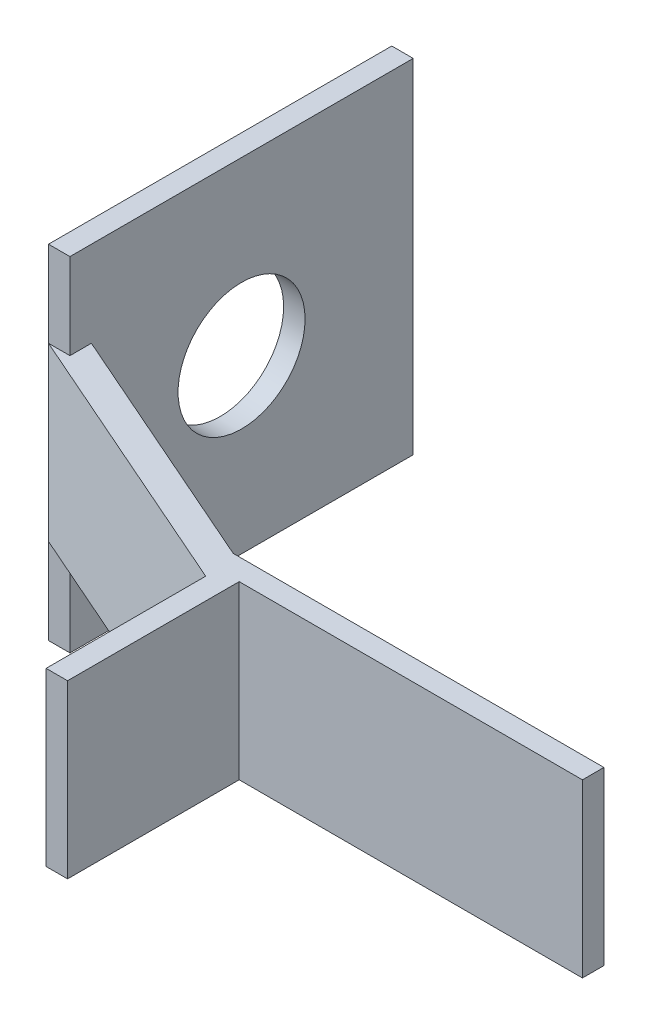
ISO-10303-21;
HEADER;
FILE_DESCRIPTION(('STEP AP214'),'2;1');
FILE_NAME('part.step','',(''),(''),'','','');
FILE_SCHEMA(('AUTOMOTIVE_DESIGN { 1 0 10303 214 1 1 1 1 }'));
ENDSEC;
DATA;
#1=APPLICATION_CONTEXT('core data for automotive mechanical design processes');
#2=APPLICATION_PROTOCOL_DEFINITION('international standard','automotive_design',2000,#1);
#3=PRODUCT_CONTEXT('',#1,'mechanical');
#4=PRODUCT('Part','Part','',(#3));
#5=PRODUCT_RELATED_PRODUCT_CATEGORY('part','',(#4));
#6=PRODUCT_DEFINITION_FORMATION('','',#4);
#7=PRODUCT_DEFINITION_CONTEXT('part definition',#1,'design');
#8=PRODUCT_DEFINITION('design','',#6,#7);
#9=PRODUCT_DEFINITION_SHAPE('','',#8);
#10=(LENGTH_UNIT() NAMED_UNIT(*) SI_UNIT(.MILLI.,.METRE.));
#11=(NAMED_UNIT(*) PLANE_ANGLE_UNIT() SI_UNIT($,.RADIAN.));
#12=(NAMED_UNIT(*) SI_UNIT($,.STERADIAN.) SOLID_ANGLE_UNIT());
#13=UNCERTAINTY_MEASURE_WITH_UNIT(LENGTH_MEASURE(1.E-05),#10,'distance_accuracy_value','');
#14=(GEOMETRIC_REPRESENTATION_CONTEXT(3) GLOBAL_UNCERTAINTY_ASSIGNED_CONTEXT((#13)) GLOBAL_UNIT_ASSIGNED_CONTEXT((#10,
#11,#12)) REPRESENTATION_CONTEXT('',''));
#15=CARTESIAN_POINT('',(0.,0.,0.));
#16=DIRECTION('',(0.,0.,1.));
#17=DIRECTION('',(1.,0.,0.));
#18=AXIS2_PLACEMENT_3D('',#15,#16,#17);
#19=CARTESIAN_POINT('',(44.6594687239784,25.4,45.013650572561));
#20=DIRECTION('',(1.,0.,0.));
#21=DIRECTION('',(0.,0.,-1.));
#22=AXIS2_PLACEMENT_3D('',#19,#20,#21);
#23=PLANE('',#22);
#24=DIRECTION('',(0.,0.,-1.));
#25=VECTOR('',#24,1.);
#26=CARTESIAN_POINT('',(44.6594687239784,-12.7,55.7043729882578));
#27=LINE('',#26,#25);
#28=CARTESIAN_POINT('',(44.6594687239784,-12.7,41.838650572561));
#29=VERTEX_POINT('',#28);
#30=CARTESIAN_POINT('',(44.6594687239784,-12.7,67.2386505725609));
#31=VERTEX_POINT('',#30);
#32=EDGE_CURVE('E194',#29,#31,#27,.F.);
#33=ORIENTED_EDGE('',*,*,#32,.F.);
#34=DIRECTION('',(0.,-1.,0.));
#35=VECTOR('',#34,1.);
#36=CARTESIAN_POINT('',(44.6594687239784,25.4,41.838650572561));
#37=LINE('',#36,#35);
#38=CARTESIAN_POINT('',(44.6594687239784,12.7,41.838650572561));
#39=VERTEX_POINT('',#38);
#40=EDGE_CURVE('E147',#39,#29,#37,.T.);
#41=ORIENTED_EDGE('',*,*,#40,.F.);
#42=DIRECTION('',(0.,0.,-1.));
#43=VECTOR('',#42,1.);
#44=CARTESIAN_POINT('',(44.6594687239784,12.7,40.4098603424682));
#45=LINE('',#44,#43);
#46=CARTESIAN_POINT('',(44.6594687239784,12.7,67.238650572561));
#47=VERTEX_POINT('',#46);
#48=EDGE_CURVE('E164',#39,#47,#45,.F.);
#49=ORIENTED_EDGE('',*,*,#48,.T.);
#50=DIRECTION('',(0.,-1.,0.));
#51=VECTOR('',#50,1.);
#52=CARTESIAN_POINT('',(44.6594687239784,25.4,67.238650572561));
#53=LINE('',#52,#51);
#54=EDGE_CURVE('E150',#31,#47,#53,.F.);
#55=ORIENTED_EDGE('',*,*,#54,.F.);
#56=EDGE_LOOP('',(#33,#41,#49,#55));
#57=FACE_BOUND('',#56,.T.);
#58=ADVANCED_FACE('F17',(#57),#23,.T.);
#59=CARTESIAN_POINT('',(44.6594687239784,25.4,67.238650572561));
#60=DIRECTION('',(0.,0.,1.));
#61=DIRECTION('',(0.,-1.,0.));
#62=AXIS2_PLACEMENT_3D('',#59,#60,#61);
#63=PLANE('',#62);
#64=DIRECTION('',(1.,0.,0.));
#65=VECTOR('',#64,1.);
#66=CARTESIAN_POINT('',(43.0297942493115,-12.7,67.2386505725607));
#67=LINE('',#66,#65);
#68=CARTESIAN_POINT('',(41.4844687239784,-12.7,67.2386505725608));
#69=VERTEX_POINT('',#68);
#70=EDGE_CURVE('E159',#31,#69,#67,.F.);
#71=ORIENTED_EDGE('',*,*,#70,.F.);
#72=ORIENTED_EDGE('',*,*,#54,.T.);
#73=DIRECTION('',(1.,0.,0.));
#74=VECTOR('',#73,1.);
#75=CARTESIAN_POINT('',(46.1214883591934,12.7,67.238650572561));
#76=LINE('',#75,#74);
#77=CARTESIAN_POINT('',(41.4844687239784,12.7,67.2386505725609));
#78=VERTEX_POINT('',#77);
#79=EDGE_CURVE('E157',#47,#78,#76,.F.);
#80=ORIENTED_EDGE('',*,*,#79,.T.);
#81=DIRECTION('',(0.,1.,0.));
#82=VECTOR('',#81,1.);
#83=CARTESIAN_POINT('',(41.4844687239784,25.4,67.2386505725607));
#84=LINE('',#83,#82);
#85=EDGE_CURVE('E196',#69,#78,#84,.T.);
#86=ORIENTED_EDGE('',*,*,#85,.F.);
#87=EDGE_LOOP('',(#71,#72,#80,#86));
#88=FACE_BOUND('',#87,.T.);
#89=ADVANCED_FACE('F155',(#88),#63,.T.);
#90=CARTESIAN_POINT('',(40.6051254319654,25.4,38.663650572561));
#91=DIRECTION('',(0.,0.,-1.));
#92=DIRECTION('',(0.,1.,0.));
#93=AXIS2_PLACEMENT_3D('',#90,#91,#92);
#94=PLANE('',#93);
#95=DIRECTION('',(1.,0.,0.));
#96=VECTOR('',#95,1.);
#97=CARTESIAN_POINT('',(43.0297942493115,-12.7,38.663650572561));
#98=LINE('',#97,#96);
#99=CARTESIAN_POINT('',(40.6051254319654,-12.7,38.6636505725609));
#100=VERTEX_POINT('',#99);
#101=CARTESIAN_POINT('',(95.4594687239786,-12.7,38.663650572561));
#102=VERTEX_POINT('',#101);
#103=EDGE_CURVE('E125',#100,#102,#98,.T.);
#104=ORIENTED_EDGE('',*,*,#103,.F.);
#105=DIRECTION('',(0.,1.,0.));
#106=VECTOR('',#105,1.);
#107=CARTESIAN_POINT('',(40.6051254319654,25.4,38.6636505725609));
#108=LINE('',#107,#106);
#109=CARTESIAN_POINT('',(40.6051254319654,12.7,38.6636505725609));
#110=VERTEX_POINT('',#109);
#111=EDGE_CURVE('E121',#110,#100,#108,.F.);
#112=ORIENTED_EDGE('',*,*,#111,.F.);
#113=DIRECTION('',(1.,0.,0.));
#114=VECTOR('',#113,1.);
#115=CARTESIAN_POINT('',(46.1214883591934,12.7,38.663650572561));
#116=LINE('',#115,#114);
#117=CARTESIAN_POINT('',(95.4594687239786,12.7,38.663650572561));
#118=VERTEX_POINT('',#117);
#119=EDGE_CURVE('E124',#110,#118,#116,.T.);
#120=ORIENTED_EDGE('',*,*,#119,.T.);
#121=DIRECTION('',(0.,1.,0.));
#122=VECTOR('',#121,1.);
#123=CARTESIAN_POINT('',(95.4594687239786,25.4,38.663650572561));
#124=LINE('',#123,#122);
#125=EDGE_CURVE('E115',#102,#118,#124,.T.);
#126=ORIENTED_EDGE('',*,*,#125,.F.);
#127=EDGE_LOOP('',(#104,#112,#120,#126));
#128=FACE_BOUND('',#127,.T.);
#129=ADVANCED_FACE('F123',(#128),#94,.T.);
#130=CARTESIAN_POINT('',(95.4594687239786,25.4,38.663650572561));
#131=DIRECTION('',(1.,0.,0.));
#132=DIRECTION('',(0.,0.,-1.));
#133=AXIS2_PLACEMENT_3D('',#130,#131,#132);
#134=PLANE('',#133);
#135=DIRECTION('',(0.,0.,-1.));
#136=VECTOR('',#135,1.);
#137=CARTESIAN_POINT('',(95.4594687239786,-12.7,55.7043729882578));
#138=LINE('',#137,#136);
#139=CARTESIAN_POINT('',(95.4594687239786,-12.7,41.838650572561));
#140=VERTEX_POINT('',#139);
#141=EDGE_CURVE('E176',#102,#140,#138,.F.);
#142=ORIENTED_EDGE('',*,*,#141,.F.);
#143=ORIENTED_EDGE('',*,*,#125,.T.);
#144=DIRECTION('',(0.,0.,-1.));
#145=VECTOR('',#144,1.);
#146=CARTESIAN_POINT('',(95.4594687239786,12.7,40.4098603424682));
#147=LINE('',#146,#145);
#148=CARTESIAN_POINT('',(95.4594687239786,12.7,41.838650572561));
#149=VERTEX_POINT('',#148);
#150=EDGE_CURVE('E138',#118,#149,#147,.F.);
#151=ORIENTED_EDGE('',*,*,#150,.T.);
#152=DIRECTION('',(0.,-1.,0.));
#153=VECTOR('',#152,1.);
#154=CARTESIAN_POINT('',(95.4594687239786,25.4,41.838650572561));
#155=LINE('',#154,#153);
#156=EDGE_CURVE('E131',#140,#149,#155,.F.);
#157=ORIENTED_EDGE('',*,*,#156,.F.);
#158=EDGE_LOOP('',(#142,#143,#151,#157));
#159=FACE_BOUND('',#158,.T.);
#160=ADVANCED_FACE('F174',(#159),#134,.T.);
#161=CARTESIAN_POINT('',(95.4594687239786,25.4,41.838650572561));
#162=DIRECTION('',(0.,0.,1.));
#163=DIRECTION('',(0.,-1.,0.));
#164=AXIS2_PLACEMENT_3D('',#161,#162,#163);
#165=PLANE('',#164);
#166=DIRECTION('',(1.,0.,0.));
#167=VECTOR('',#166,1.);
#168=CARTESIAN_POINT('',(43.0297942493115,-12.7,41.838650572561));
#169=LINE('',#168,#167);
#170=EDGE_CURVE('E179',#140,#29,#169,.F.);
#171=ORIENTED_EDGE('',*,*,#170,.F.);
#172=ORIENTED_EDGE('',*,*,#156,.T.);
#173=DIRECTION('',(1.,0.,0.));
#174=VECTOR('',#173,1.);
#175=CARTESIAN_POINT('',(46.1214883591934,12.7,41.838650572561));
#176=LINE('',#175,#174);
#177=EDGE_CURVE('E169',#149,#39,#176,.F.);
#178=ORIENTED_EDGE('',*,*,#177,.T.);
#179=ORIENTED_EDGE('',*,*,#40,.T.);
#180=EDGE_LOOP('',(#171,#172,#178,#179));
#181=FACE_BOUND('',#180,.T.);
#182=ADVANCED_FACE('F180',(#181),#165,.T.);
#183=CARTESIAN_POINT('',(3.17500000000005,25.4,22.225));
#184=DIRECTION('',(0.402111316497173,0.,-0.915590786948466));
#185=DIRECTION('',(-0.915590786948466,0.,-0.402111316497173));
#186=AXIS2_PLACEMENT_3D('',#183,#184,#185);
#187=PLANE('',#186);
#188=DIRECTION('',(0.915590786948465,0.,0.402111316497174));
#189=VECTOR('',#188,1.);
#190=CARTESIAN_POINT('',(3.17500000000005,-12.7,22.225));
#191=LINE('',#190,#189);
#192=CARTESIAN_POINT('',(3.17500000000001,-12.7,22.225));
#193=VERTEX_POINT('',#192);
#194=EDGE_CURVE('E189',#193,#100,#191,.T.);
#195=ORIENTED_EDGE('',*,*,#194,.F.);
#196=DIRECTION('',(0.,1.,0.));
#197=VECTOR('',#196,1.);
#198=CARTESIAN_POINT('',(3.175,0.,22.225));
#199=LINE('',#198,#197);
#200=CARTESIAN_POINT('',(3.17499999999999,12.7,22.225));
#201=VERTEX_POINT('',#200);
#202=EDGE_CURVE('E142',#201,#193,#199,.F.);
#203=ORIENTED_EDGE('',*,*,#202,.F.);
#204=DIRECTION('',(0.915590786948465,0.,0.402111316497174));
#205=VECTOR('',#204,1.);
#206=CARTESIAN_POINT('',(3.17500000000005,12.7,22.225));
#207=LINE('',#206,#205);
#208=EDGE_CURVE('E130',#201,#110,#207,.T.);
#209=ORIENTED_EDGE('',*,*,#208,.T.);
#210=ORIENTED_EDGE('',*,*,#111,.T.);
#211=EDGE_LOOP('',(#195,#203,#209,#210));
#212=FACE_BOUND('',#211,.T.);
#213=ADVANCED_FACE('F141',(#212),#187,.T.);
#214=CARTESIAN_POINT('',(46.1214883591934,12.7,40.4098603424682));
#215=DIRECTION('',(0.,-1.,0.));
#216=DIRECTION('',(0.,0.,-1.));
#217=AXIS2_PLACEMENT_3D('',#214,#215,#216);
#218=PLANE('',#217);
#219=DIRECTION('',(0.,0.,1.));
#220=VECTOR('',#219,1.);
#221=CARTESIAN_POINT('',(41.4844687239784,12.7,67.238650572561));
#222=LINE('',#221,#220);
#223=CARTESIAN_POINT('',(41.4844687239784,12.7,43.6192466007456));
#224=VERTEX_POINT('',#223);
#225=EDGE_CURVE('E167',#78,#224,#222,.F.);
#226=ORIENTED_EDGE('',*,*,#225,.F.);
#227=ORIENTED_EDGE('',*,*,#79,.F.);
#228=ORIENTED_EDGE('',*,*,#48,.F.);
#229=ORIENTED_EDGE('',*,*,#177,.F.);
#230=ORIENTED_EDGE('',*,*,#150,.F.);
#231=ORIENTED_EDGE('',*,*,#119,.F.);
#232=ORIENTED_EDGE('',*,*,#208,.F.);
#233=DIRECTION('',(0.,0.,-1.));
#234=VECTOR('',#233,1.);
#235=CARTESIAN_POINT('',(3.175,12.7,-215.9));
#236=LINE('',#235,#234);
#237=CARTESIAN_POINT('',(3.17499999999997,12.7,25.4));
#238=VERTEX_POINT('',#237);
#239=EDGE_CURVE('E182',#238,#201,#236,.T.);
#240=ORIENTED_EDGE('',*,*,#239,.F.);
#241=DIRECTION('',(1.,0.,0.));
#242=VECTOR('',#241,1.);
#243=CARTESIAN_POINT('',(0.,12.7,25.4));
#244=LINE('',#243,#242);
#245=CARTESIAN_POINT('',(0.,12.7,25.4));
#246=VERTEX_POINT('',#245);
#247=EDGE_CURVE('E214',#238,#246,#244,.F.);
#248=ORIENTED_EDGE('',*,*,#247,.T.);
#249=DIRECTION('',(0.915590786948466,0.,0.402111316497172));
#250=VECTOR('',#249,1.);
#251=CARTESIAN_POINT('',(44.6594687239784,12.7,45.013650572561));
#252=LINE('',#251,#250);
#253=EDGE_CURVE('E207',#224,#246,#252,.F.);
#254=ORIENTED_EDGE('',*,*,#253,.F.);
#255=EDGE_LOOP('',(#226,#227,#228,#229,#230,#231,#232,#240,#248,#254));
#256=FACE_BOUND('',#255,.T.);
#257=ADVANCED_FACE('F135',(#256),#218,.F.);
#258=CARTESIAN_POINT('',(41.4844687239784,25.4,67.238650572561));
#259=DIRECTION('',(-1.,0.,0.));
#260=DIRECTION('',(0.,0.,1.));
#261=AXIS2_PLACEMENT_3D('',#258,#259,#260);
#262=PLANE('',#261);
#263=DIRECTION('',(0.,0.,-1.));
#264=VECTOR('',#263,1.);
#265=CARTESIAN_POINT('',(41.4844687239784,-12.7,55.7043729882578));
#266=LINE('',#265,#264);
#267=CARTESIAN_POINT('',(41.4844687239784,-12.7,43.6192466007456));
#268=VERTEX_POINT('',#267);
#269=EDGE_CURVE('E191',#69,#268,#266,.T.);
#270=ORIENTED_EDGE('',*,*,#269,.F.);
#271=ORIENTED_EDGE('',*,*,#85,.T.);
#272=ORIENTED_EDGE('',*,*,#225,.T.);
#273=DIRECTION('',(0.,1.,0.));
#274=VECTOR('',#273,1.);
#275=CARTESIAN_POINT('',(41.4844687239784,25.4,43.6192466007456));
#276=LINE('',#275,#274);
#277=EDGE_CURVE('E202',#268,#224,#276,.T.);
#278=ORIENTED_EDGE('',*,*,#277,.F.);
#279=EDGE_LOOP('',(#270,#271,#272,#278));
#280=FACE_BOUND('',#279,.T.);
#281=ADVANCED_FACE('F201',(#280),#262,.T.);
#282=CARTESIAN_POINT('',(43.0297942493115,-12.7,55.7043729882578));
#283=DIRECTION('',(0.,-1.,0.));
#284=DIRECTION('',(0.,0.,-1.));
#285=AXIS2_PLACEMENT_3D('',#282,#283,#284);
#286=PLANE('',#285);
#287=ORIENTED_EDGE('',*,*,#141,.T.);
#288=ORIENTED_EDGE('',*,*,#170,.T.);
#289=ORIENTED_EDGE('',*,*,#32,.T.);
#290=ORIENTED_EDGE('',*,*,#70,.T.);
#291=ORIENTED_EDGE('',*,*,#269,.T.);
#292=DIRECTION('',(0.915590786948466,0.,0.402111316497172));
#293=VECTOR('',#292,1.);
#294=CARTESIAN_POINT('',(44.6594687239784,-12.7,45.0136505725609));
#295=LINE('',#294,#293);
#296=CARTESIAN_POINT('',(0.,-12.7,25.4));
#297=VERTEX_POINT('',#296);
#298=EDGE_CURVE('E210',#297,#268,#295,.T.);
#299=ORIENTED_EDGE('',*,*,#298,.F.);
#300=DIRECTION('',(1.,0.,0.));
#301=VECTOR('',#300,1.);
#302=CARTESIAN_POINT('',(0.,-12.7,25.4));
#303=LINE('',#302,#301);
#304=CARTESIAN_POINT('',(3.17499999999997,-12.7,25.4));
#305=VERTEX_POINT('',#304);
#306=EDGE_CURVE('E211',#305,#297,#303,.F.);
#307=ORIENTED_EDGE('',*,*,#306,.F.);
#308=DIRECTION('',(0.,0.,-1.));
#309=VECTOR('',#308,1.);
#310=CARTESIAN_POINT('',(3.175,-12.7,-215.9));
#311=LINE('',#310,#309);
#312=EDGE_CURVE('E228',#193,#305,#311,.F.);
#313=ORIENTED_EDGE('',*,*,#312,.F.);
#314=ORIENTED_EDGE('',*,*,#194,.T.);
#315=ORIENTED_EDGE('',*,*,#103,.T.);
#316=EDGE_LOOP('',(#287,#288,#289,#290,#291,#299,#307,#313,#314,#315));
#317=FACE_BOUND('',#316,.T.);
#318=ADVANCED_FACE('F235',(#317),#286,.T.);
#319=CARTESIAN_POINT('',(3.175,0.,-215.9));
#320=DIRECTION('',(1.,0.,0.));
#321=DIRECTION('',(0.,0.,-1.));
#322=AXIS2_PLACEMENT_3D('',#319,#320,#321);
#323=PLANE('',#322);
#324=CARTESIAN_POINT('',(3.175,0.,0.));
#325=DIRECTION('',(1.,0.,0.));
#326=DIRECTION('',(0.,0.,-1.));
#327=AXIS2_PLACEMENT_3D('',#324,#325,#326);
#328=CIRCLE('',#327,9.398);
#329=CARTESIAN_POINT('',(3.175,0.,-9.398));
#330=VERTEX_POINT('',#329);
#331=EDGE_CURVE('E20',#330,#330,#328,.F.);
#332=ORIENTED_EDGE('',*,*,#331,.T.);
#333=EDGE_LOOP('',(#332));
#334=FACE_BOUND('',#333,.T.);
#335=DIRECTION('',(0.,1.,0.));
#336=VECTOR('',#335,1.);
#337=CARTESIAN_POINT('',(3.175,25.4,25.4));
#338=LINE('',#337,#336);
#339=CARTESIAN_POINT('',(3.175,-25.4,25.4));
#340=VERTEX_POINT('',#339);
#341=EDGE_CURVE('E239',#340,#305,#338,.T.);
#342=ORIENTED_EDGE('',*,*,#341,.F.);
#343=DIRECTION('',(0.,0.,-1.));
#344=VECTOR('',#343,1.);
#345=CARTESIAN_POINT('',(3.175,-25.4,25.4));
#346=LINE('',#345,#344);
#347=CARTESIAN_POINT('',(3.175,-25.4,-25.4));
#348=VERTEX_POINT('',#347);
#349=EDGE_CURVE('E241',#348,#340,#346,.F.);
#350=ORIENTED_EDGE('',*,*,#349,.F.);
#351=DIRECTION('',(0.,1.,0.));
#352=VECTOR('',#351,1.);
#353=CARTESIAN_POINT('',(3.175,-25.4,-25.4));
#354=LINE('',#353,#352);
#355=CARTESIAN_POINT('',(3.17499999999999,25.4,-25.4));
#356=VERTEX_POINT('',#355);
#357=EDGE_CURVE('E247',#356,#348,#354,.F.);
#358=ORIENTED_EDGE('',*,*,#357,.F.);
#359=DIRECTION('',(0.,0.,1.));
#360=VECTOR('',#359,1.);
#361=CARTESIAN_POINT('',(3.17499999999995,25.4000000000003,-457.2));
#362=LINE('',#361,#360);
#363=CARTESIAN_POINT('',(3.17499999999997,25.4,25.4));
#364=VERTEX_POINT('',#363);
#365=EDGE_CURVE('E226',#364,#356,#362,.F.);
#366=ORIENTED_EDGE('',*,*,#365,.F.);
#367=DIRECTION('',(0.,1.,0.));
#368=VECTOR('',#367,1.);
#369=CARTESIAN_POINT('',(3.17499999999995,25.4,25.4));
#370=LINE('',#369,#368);
#371=EDGE_CURVE('E223',#364,#238,#370,.F.);
#372=ORIENTED_EDGE('',*,*,#371,.T.);
#373=ORIENTED_EDGE('',*,*,#239,.T.);
#374=ORIENTED_EDGE('',*,*,#202,.T.);
#375=ORIENTED_EDGE('',*,*,#312,.T.);
#376=EDGE_LOOP('',(#342,#350,#358,#366,#372,#373,#374,#375));
#377=FACE_BOUND('',#376,.T.);
#378=ADVANCED_FACE('F231',(#334,#377),#323,.T.);
#379=CARTESIAN_POINT('',(0.,25.4000000000003,-457.2));
#380=DIRECTION('',(0.,1.,0.));
#381=DIRECTION('',(0.,0.,1.));
#382=AXIS2_PLACEMENT_3D('',#379,#380,#381);
#383=PLANE('',#382);
#384=DIRECTION('',(1.,0.,0.));
#385=VECTOR('',#384,1.);
#386=CARTESIAN_POINT('',(0.,25.4,25.4));
#387=LINE('',#386,#385);
#388=CARTESIAN_POINT('',(0.,25.4,25.4));
#389=VERTEX_POINT('',#388);
#390=EDGE_CURVE('E216',#389,#364,#387,.T.);
#391=ORIENTED_EDGE('',*,*,#390,.T.);
#392=ORIENTED_EDGE('',*,*,#365,.T.);
#393=DIRECTION('',(-1.,0.,0.));
#394=VECTOR('',#393,1.);
#395=CARTESIAN_POINT('',(3.175,25.4,-25.4));
#396=LINE('',#395,#394);
#397=CARTESIAN_POINT('',(0.,25.4,-25.4));
#398=VERTEX_POINT('',#397);
#399=EDGE_CURVE('E250',#398,#356,#396,.F.);
#400=ORIENTED_EDGE('',*,*,#399,.F.);
#401=DIRECTION('',(0.,0.,-1.));
#402=VECTOR('',#401,1.);
#403=CARTESIAN_POINT('',(0.,25.4,-215.9));
#404=LINE('',#403,#402);
#405=EDGE_CURVE('E253',#398,#389,#404,.F.);
#406=ORIENTED_EDGE('',*,*,#405,.T.);
#407=EDGE_LOOP('',(#391,#392,#400,#406));
#408=FACE_BOUND('',#407,.T.);
#409=ADVANCED_FACE('F282',(#408),#383,.T.);
#410=CARTESIAN_POINT('',(0.,25.4,25.4));
#411=DIRECTION('',(0.,0.,-1.));
#412=DIRECTION('',(0.,1.,0.));
#413=AXIS2_PLACEMENT_3D('',#410,#411,#412);
#414=PLANE('',#413);
#415=DIRECTION('',(0.,1.,0.));
#416=VECTOR('',#415,1.);
#417=CARTESIAN_POINT('',(0.,0.,25.4));
#418=LINE('',#417,#416);
#419=EDGE_CURVE('E256',#389,#246,#418,.F.);
#420=ORIENTED_EDGE('',*,*,#419,.T.);
#421=ORIENTED_EDGE('',*,*,#247,.F.);
#422=ORIENTED_EDGE('',*,*,#371,.F.);
#423=ORIENTED_EDGE('',*,*,#390,.F.);
#424=EDGE_LOOP('',(#420,#421,#422,#423));
#425=FACE_BOUND('',#424,.T.);
#426=ADVANCED_FACE('F279',(#425),#414,.F.);
#427=CARTESIAN_POINT('',(44.6594687239784,25.4,45.013650572561));
#428=DIRECTION('',(-0.402111316497172,0.,0.915590786948466));
#429=DIRECTION('',(0.915590786948466,0.,0.402111316497172));
#430=AXIS2_PLACEMENT_3D('',#427,#428,#429);
#431=PLANE('',#430);
#432=ORIENTED_EDGE('',*,*,#298,.T.);
#433=ORIENTED_EDGE('',*,*,#277,.T.);
#434=ORIENTED_EDGE('',*,*,#253,.T.);
#435=DIRECTION('',(0.,1.,0.));
#436=VECTOR('',#435,1.);
#437=CARTESIAN_POINT('',(0.,0.,25.4));
#438=LINE('',#437,#436);
#439=EDGE_CURVE('E259',#246,#297,#438,.F.);
#440=ORIENTED_EDGE('',*,*,#439,.T.);
#441=EDGE_LOOP('',(#432,#433,#434,#440));
#442=FACE_BOUND('',#441,.T.);
#443=ADVANCED_FACE('F205',(#442),#431,.T.);
#444=CARTESIAN_POINT('',(0.,25.4,25.4));
#445=DIRECTION('',(0.,0.,1.));
#446=DIRECTION('',(1.,0.,0.));
#447=AXIS2_PLACEMENT_3D('',#444,#445,#446);
#448=PLANE('',#447);
#449=DIRECTION('',(1.,0.,0.));
#450=VECTOR('',#449,1.);
#451=CARTESIAN_POINT('',(0.,-25.4,25.4));
#452=LINE('',#451,#450);
#453=CARTESIAN_POINT('',(0.,-25.4,25.4));
#454=VERTEX_POINT('',#453);
#455=EDGE_CURVE('E245',#340,#454,#452,.F.);
#456=ORIENTED_EDGE('',*,*,#455,.F.);
#457=ORIENTED_EDGE('',*,*,#341,.T.);
#458=ORIENTED_EDGE('',*,*,#306,.T.);
#459=DIRECTION('',(0.,1.,0.));
#460=VECTOR('',#459,1.);
#461=CARTESIAN_POINT('',(0.,0.,25.4));
#462=LINE('',#461,#460);
#463=EDGE_CURVE('E261',#297,#454,#462,.F.);
#464=ORIENTED_EDGE('',*,*,#463,.T.);
#465=EDGE_LOOP('',(#456,#457,#458,#464));
#466=FACE_BOUND('',#465,.T.);
#467=ADVANCED_FACE('F277',(#466),#448,.T.);
#468=CARTESIAN_POINT('',(0.,-25.4,25.4));
#469=DIRECTION('',(0.,-1.,0.));
#470=DIRECTION('',(0.,0.,-1.));
#471=AXIS2_PLACEMENT_3D('',#468,#469,#470);
#472=PLANE('',#471);
#473=ORIENTED_EDGE('',*,*,#455,.T.);
#474=DIRECTION('',(0.,0.,-1.));
#475=VECTOR('',#474,1.);
#476=CARTESIAN_POINT('',(0.,-25.4,-215.9));
#477=LINE('',#476,#475);
#478=CARTESIAN_POINT('',(0.,-25.4,-25.4));
#479=VERTEX_POINT('',#478);
#480=EDGE_CURVE('E263',#454,#479,#477,.T.);
#481=ORIENTED_EDGE('',*,*,#480,.T.);
#482=DIRECTION('',(-1.,0.,0.));
#483=VECTOR('',#482,1.);
#484=CARTESIAN_POINT('',(3.175,-25.4,-25.4));
#485=LINE('',#484,#483);
#486=EDGE_CURVE('E34',#348,#479,#485,.T.);
#487=ORIENTED_EDGE('',*,*,#486,.F.);
#488=ORIENTED_EDGE('',*,*,#349,.T.);
#489=EDGE_LOOP('',(#473,#481,#487,#488));
#490=FACE_BOUND('',#489,.T.);
#491=ADVANCED_FACE('F274',(#490),#472,.T.);
#492=CARTESIAN_POINT('',(3.175,-25.4,-25.4));
#493=DIRECTION('',(0.,0.,-1.));
#494=DIRECTION('',(-1.,0.,0.));
#495=AXIS2_PLACEMENT_3D('',#492,#493,#494);
#496=PLANE('',#495);
#497=DIRECTION('',(0.,1.,0.));
#498=VECTOR('',#497,1.);
#499=CARTESIAN_POINT('',(0.,0.,-25.4));
#500=LINE('',#499,#498);
#501=EDGE_CURVE('E26',#479,#398,#500,.T.);
#502=ORIENTED_EDGE('',*,*,#501,.T.);
#503=ORIENTED_EDGE('',*,*,#399,.T.);
#504=ORIENTED_EDGE('',*,*,#357,.T.);
#505=ORIENTED_EDGE('',*,*,#486,.T.);
#506=EDGE_LOOP('',(#502,#503,#504,#505));
#507=FACE_BOUND('',#506,.T.);
#508=ADVANCED_FACE('F266',(#507),#496,.T.);
#509=CARTESIAN_POINT('',(0.,0.,0.));
#510=DIRECTION('',(1.,0.,0.));
#511=DIRECTION('',(0.,0.,-1.));
#512=AXIS2_PLACEMENT_3D('',#509,#510,#511);
#513=CYLINDRICAL_SURFACE('',#512,9.398);
#514=CARTESIAN_POINT('',(0.,0.,0.));
#515=DIRECTION('',(1.,0.,0.));
#516=DIRECTION('',(0.,0.,-1.));
#517=AXIS2_PLACEMENT_3D('',#514,#515,#516);
#518=CIRCLE('',#517,9.398);
#519=CARTESIAN_POINT('',(0.,0.,-9.398));
#520=VERTEX_POINT('',#519);
#521=EDGE_CURVE('E11',#520,#520,#518,.F.);
#522=ORIENTED_EDGE('',*,*,#521,.T.);
#523=EDGE_LOOP('',(#522));
#524=FACE_BOUND('',#523,.T.);
#525=ORIENTED_EDGE('',*,*,#331,.F.);
#526=EDGE_LOOP('',(#525));
#527=FACE_BOUND('',#526,.T.);
#528=ADVANCED_FACE('F294',(#524,#527),#513,.F.);
#529=CARTESIAN_POINT('',(0.,0.,-215.9));
#530=DIRECTION('',(1.,0.,0.));
#531=DIRECTION('',(0.,0.,-1.));
#532=AXIS2_PLACEMENT_3D('',#529,#530,#531);
#533=PLANE('',#532);
#534=ORIENTED_EDGE('',*,*,#521,.F.);
#535=EDGE_LOOP('',(#534));
#536=FACE_BOUND('',#535,.T.);
#537=ORIENTED_EDGE('',*,*,#480,.F.);
#538=ORIENTED_EDGE('',*,*,#463,.F.);
#539=ORIENTED_EDGE('',*,*,#439,.F.);
#540=ORIENTED_EDGE('',*,*,#419,.F.);
#541=ORIENTED_EDGE('',*,*,#405,.F.);
#542=ORIENTED_EDGE('',*,*,#501,.F.);
#543=EDGE_LOOP('',(#537,#538,#539,#540,#541,#542));
#544=FACE_BOUND('',#543,.T.);
#545=ADVANCED_FACE('F271',(#536,#544),#533,.F.);
#546=CLOSED_SHELL('',(#58,#89,#129,#160,#182,#213,#257,#281,#318,#378,#409,#426,#443,#467,#491,
#508,#528,#545));
#547=MANIFOLD_SOLID_BREP('B1',#546);
#548=ADVANCED_BREP_SHAPE_REPRESENTATION('',(#18,#547),#14);
#549=SHAPE_DEFINITION_REPRESENTATION(#9,#548);
ENDSEC;
END-ISO-10303-21;
